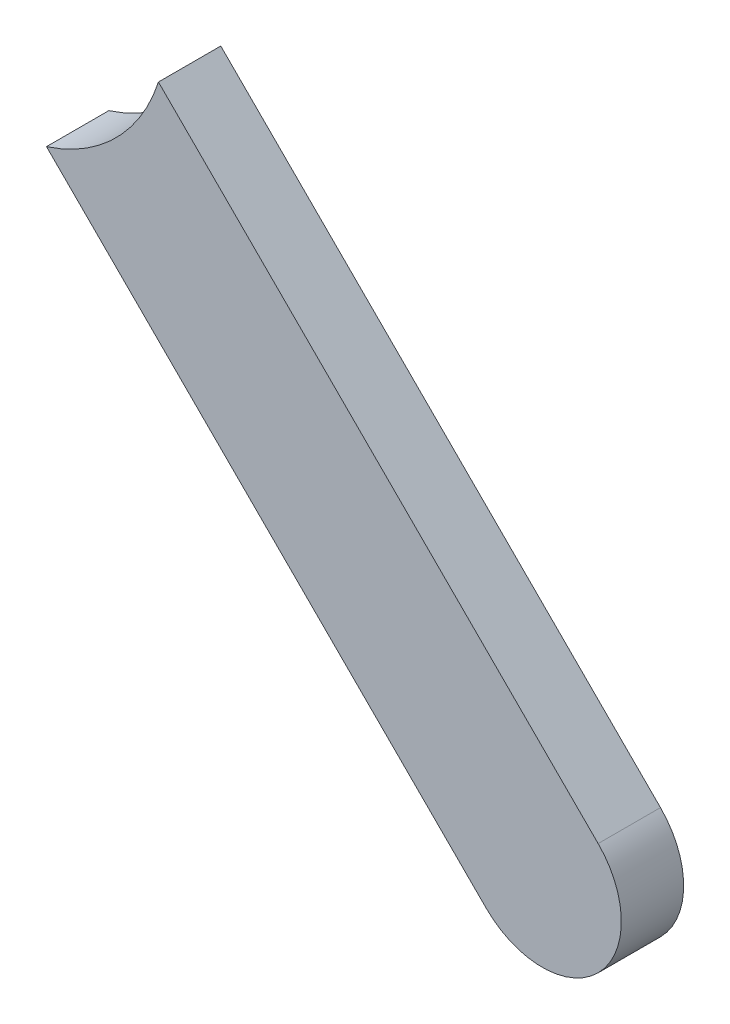
ISO-10303-21;
HEADER;
FILE_DESCRIPTION(('STEP AP214'),'2;1');
FILE_NAME('part.step','',(''),(''),'','','');
FILE_SCHEMA(('AUTOMOTIVE_DESIGN { 1 0 10303 214 1 1 1 1 }'));
ENDSEC;
DATA;
#1=APPLICATION_CONTEXT('core data for automotive mechanical design processes');
#2=APPLICATION_PROTOCOL_DEFINITION('international standard','automotive_design',2000,#1);
#3=PRODUCT_CONTEXT('',#1,'mechanical');
#4=PRODUCT('Part','Part','',(#3));
#5=PRODUCT_RELATED_PRODUCT_CATEGORY('part','',(#4));
#6=PRODUCT_DEFINITION_FORMATION('','',#4);
#7=PRODUCT_DEFINITION_CONTEXT('part definition',#1,'design');
#8=PRODUCT_DEFINITION('design','',#6,#7);
#9=PRODUCT_DEFINITION_SHAPE('','',#8);
#10=(LENGTH_UNIT() NAMED_UNIT(*) SI_UNIT(.MILLI.,.METRE.));
#11=(NAMED_UNIT(*) PLANE_ANGLE_UNIT() SI_UNIT($,.RADIAN.));
#12=(NAMED_UNIT(*) SI_UNIT($,.STERADIAN.) SOLID_ANGLE_UNIT());
#13=UNCERTAINTY_MEASURE_WITH_UNIT(LENGTH_MEASURE(1.E-05),#10,'distance_accuracy_value','');
#14=(GEOMETRIC_REPRESENTATION_CONTEXT(3) GLOBAL_UNCERTAINTY_ASSIGNED_CONTEXT((#13)) GLOBAL_UNIT_ASSIGNED_CONTEXT((#10,
#11,#12)) REPRESENTATION_CONTEXT('',''));
#15=CARTESIAN_POINT('',(0.,0.,0.));
#16=DIRECTION('',(0.,0.,1.));
#17=DIRECTION('',(1.,0.,0.));
#18=AXIS2_PLACEMENT_3D('',#15,#16,#17);
#19=CARTESIAN_POINT('',(113.954062741144,77.8304609788559,0.));
#20=DIRECTION('',(0.70710678118655,0.707106781186545,0.));
#21=DIRECTION('',(0.707106781186545,-0.70710678118655,0.));
#22=AXIS2_PLACEMENT_3D('',#19,#20,#21);
#23=PLANE('',#22);
#24=DIRECTION('',(0.707106781186545,-0.70710678118655,0.));
#25=VECTOR('',#24,1.);
#26=CARTESIAN_POINT('',(113.60512966,78.17939406,0.1999996));
#27=LINE('',#26,#25);
#28=CARTESIAN_POINT('',(113.954062741144,77.8304609788559,0.1999996));
#29=VERTEX_POINT('',#28);
#30=CARTESIAN_POINT('',(115.36499406,76.41952966,0.1999996));
#31=VERTEX_POINT('',#30);
#32=EDGE_CURVE('E11',#29,#31,#27,.T.);
#33=ORIENTED_EDGE('',*,*,#32,.F.);
#34=DIRECTION('',(0.,0.,1.));
#35=VECTOR('',#34,1.);
#36=CARTESIAN_POINT('',(113.954062741144,77.8304609788559,0.));
#37=LINE('',#36,#35);
#38=CARTESIAN_POINT('',(113.954062741144,77.8304609788559,0.));
#39=VERTEX_POINT('',#38);
#40=EDGE_CURVE('E24',#39,#29,#37,.T.);
#41=ORIENTED_EDGE('',*,*,#40,.F.);
#42=DIRECTION('',(0.707106781186545,-0.70710678118655,0.));
#43=VECTOR('',#42,1.);
#44=CARTESIAN_POINT('',(113.60512966,78.17939406,0.));
#45=LINE('',#44,#43);
#46=CARTESIAN_POINT('',(115.36499406,76.41952966,0.));
#47=VERTEX_POINT('',#46);
#48=EDGE_CURVE('E75',#39,#47,#45,.T.);
#49=ORIENTED_EDGE('',*,*,#48,.T.);
#50=DIRECTION('',(0.,0.,1.));
#51=VECTOR('',#50,1.);
#52=CARTESIAN_POINT('',(115.36499406,76.41952966,0.));
#53=LINE('',#52,#51);
#54=EDGE_CURVE('E37',#47,#31,#53,.T.);
#55=ORIENTED_EDGE('',*,*,#54,.T.);
#56=EDGE_LOOP('',(#33,#41,#49,#55));
#57=FACE_BOUND('',#56,.T.);
#58=ADVANCED_FACE('F17',(#57),#23,.F.);
#59=CARTESIAN_POINT('',(115.5446,76.5991356,0.));
#60=DIRECTION('',(0.,0.,-1.));
#61=DIRECTION('',(-0.707106781186548,-0.707106781186548,0.));
#62=AXIS2_PLACEMENT_3D('',#59,#60,#61);
#63=CYLINDRICAL_SURFACE('',#62,0.254001156230771);
#64=CARTESIAN_POINT('',(115.5446,76.5991356,0.1999996));
#65=DIRECTION('',(0.,0.,1.));
#66=DIRECTION('',(-0.707106781186548,-0.707106781186548,0.));
#67=AXIS2_PLACEMENT_3D('',#64,#65,#66);
#68=CIRCLE('',#67,0.254001156230771);
#69=CARTESIAN_POINT('',(115.72420594,76.77874154,0.1999996));
#70=VERTEX_POINT('',#69);
#71=EDGE_CURVE('E83',#31,#70,#68,.T.);
#72=ORIENTED_EDGE('',*,*,#71,.F.);
#73=ORIENTED_EDGE('',*,*,#54,.F.);
#74=CARTESIAN_POINT('',(115.5446,76.5991356,0.));
#75=DIRECTION('',(0.,0.,1.));
#76=DIRECTION('',(-0.707106781186548,-0.707106781186548,0.));
#77=AXIS2_PLACEMENT_3D('',#74,#75,#76);
#78=CIRCLE('',#77,0.254001156230771);
#79=CARTESIAN_POINT('',(115.72420594,76.77874154,0.));
#80=VERTEX_POINT('',#79);
#81=EDGE_CURVE('E81',#47,#80,#78,.T.);
#82=ORIENTED_EDGE('',*,*,#81,.T.);
#83=DIRECTION('',(0.,0.,1.));
#84=VECTOR('',#83,1.);
#85=CARTESIAN_POINT('',(115.72420594,76.77874154,0.));
#86=LINE('',#85,#84);
#87=EDGE_CURVE('E67',#80,#70,#86,.T.);
#88=ORIENTED_EDGE('',*,*,#87,.T.);
#89=EDGE_LOOP('',(#72,#73,#82,#88));
#90=FACE_BOUND('',#89,.T.);
#91=ADVANCED_FACE('F89',(#90),#63,.T.);
#92=CARTESIAN_POINT('',(115.72420594,76.77874154,0.));
#93=DIRECTION('',(-0.70710678118655,-0.707106781186545,0.));
#94=DIRECTION('',(-0.707106781186545,0.70710678118655,0.));
#95=AXIS2_PLACEMENT_3D('',#92,#93,#94);
#96=PLANE('',#95);
#97=DIRECTION('',(-0.707106781186545,0.70710678118655,0.));
#98=VECTOR('',#97,1.);
#99=CARTESIAN_POINT('',(115.72420594,76.77874154,0.1999996));
#100=LINE('',#99,#98);
#101=CARTESIAN_POINT('',(114.313274621144,78.1896728588559,0.1999996));
#102=VERTEX_POINT('',#101);
#103=EDGE_CURVE('E71',#70,#102,#100,.T.);
#104=ORIENTED_EDGE('',*,*,#103,.F.);
#105=ORIENTED_EDGE('',*,*,#87,.F.);
#106=DIRECTION('',(-0.707106781186545,0.70710678118655,0.));
#107=VECTOR('',#106,1.);
#108=CARTESIAN_POINT('',(115.72420594,76.77874154,0.));
#109=LINE('',#108,#107);
#110=CARTESIAN_POINT('',(114.313274621144,78.1896728588559,0.));
#111=VERTEX_POINT('',#110);
#112=EDGE_CURVE('E63',#80,#111,#109,.T.);
#113=ORIENTED_EDGE('',*,*,#112,.T.);
#114=DIRECTION('',(0.,0.,1.));
#115=VECTOR('',#114,1.);
#116=CARTESIAN_POINT('',(114.313274621144,78.1896728588559,0.));
#117=LINE('',#116,#115);
#118=EDGE_CURVE('E53',#111,#102,#117,.T.);
#119=ORIENTED_EDGE('',*,*,#118,.T.);
#120=EDGE_LOOP('',(#104,#105,#113,#119));
#121=FACE_BOUND('',#120,.T.);
#122=ADVANCED_FACE('F66',(#121),#96,.F.);
#123=CARTESIAN_POINT('',(113.7847356,78.359,0.));
#124=DIRECTION('',(0.,0.,-1.));
#125=DIRECTION('',(1.,0.,0.));
#126=AXIS2_PLACEMENT_3D('',#123,#124,#125);
#127=CYLINDRICAL_SURFACE('',#126,0.55500016);
#128=ORIENTED_EDGE('',*,*,#40,.T.);
#129=CARTESIAN_POINT('',(113.7847356,78.359,0.1999996));
#130=DIRECTION('',(0.,0.,1.));
#131=DIRECTION('',(1.,0.,0.));
#132=AXIS2_PLACEMENT_3D('',#129,#130,#131);
#133=CIRCLE('',#132,0.55500016);
#134=EDGE_CURVE('E59',#29,#102,#133,.T.);
#135=ORIENTED_EDGE('',*,*,#134,.T.);
#136=ORIENTED_EDGE('',*,*,#118,.F.);
#137=CARTESIAN_POINT('',(113.7847356,78.359,0.));
#138=DIRECTION('',(0.,0.,1.));
#139=DIRECTION('',(1.,0.,0.));
#140=AXIS2_PLACEMENT_3D('',#137,#138,#139);
#141=CIRCLE('',#140,0.55500016);
#142=EDGE_CURVE('E57',#39,#111,#141,.T.);
#143=ORIENTED_EDGE('',*,*,#142,.F.);
#144=EDGE_LOOP('',(#128,#135,#136,#143));
#145=FACE_BOUND('',#144,.T.);
#146=ADVANCED_FACE('F55',(#145),#127,.F.);
#147=CARTESIAN_POINT('',(113.60512966,78.17939406,0.));
#148=DIRECTION('',(0.,0.,-1.));
#149=DIRECTION('',(-1.,0.,0.));
#150=AXIS2_PLACEMENT_3D('',#147,#148,#149);
#151=PLANE('',#150);
#152=ORIENTED_EDGE('',*,*,#48,.F.);
#153=ORIENTED_EDGE('',*,*,#142,.T.);
#154=ORIENTED_EDGE('',*,*,#112,.F.);
#155=ORIENTED_EDGE('',*,*,#81,.F.);
#156=EDGE_LOOP('',(#152,#153,#154,#155));
#157=FACE_BOUND('',#156,.T.);
#158=ADVANCED_FACE('F74',(#157),#151,.T.);
#159=CARTESIAN_POINT('',(113.60512966,78.17939406,0.1999996));
#160=DIRECTION('',(0.,0.,-1.));
#161=DIRECTION('',(-1.,0.,0.));
#162=AXIS2_PLACEMENT_3D('',#159,#160,#161);
#163=PLANE('',#162);
#164=ORIENTED_EDGE('',*,*,#134,.F.);
#165=ORIENTED_EDGE('',*,*,#32,.T.);
#166=ORIENTED_EDGE('',*,*,#71,.T.);
#167=ORIENTED_EDGE('',*,*,#103,.T.);
#168=EDGE_LOOP('',(#164,#165,#166,#167));
#169=FACE_BOUND('',#168,.T.);
#170=ADVANCED_FACE('F91',(#169),#163,.F.);
#171=CLOSED_SHELL('',(#58,#91,#122,#146,#158,#170));
#172=MANIFOLD_SOLID_BREP('B1',#171);
#173=ADVANCED_BREP_SHAPE_REPRESENTATION('',(#18,#172),#14);
#174=SHAPE_DEFINITION_REPRESENTATION(#9,#173);
ENDSEC;
END-ISO-10303-21;
